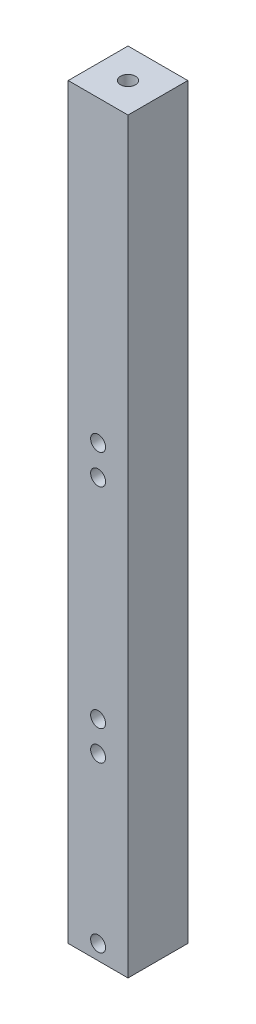
ISO-10303-21;
HEADER;
FILE_DESCRIPTION(('STEP AP214'),'2;1');
FILE_NAME('part.step','',(''),(''),'','','');
FILE_SCHEMA(('AUTOMOTIVE_DESIGN { 1 0 10303 214 1 1 1 1 }'));
ENDSEC;
DATA;
#1=APPLICATION_CONTEXT('core data for automotive mechanical design processes');
#2=APPLICATION_PROTOCOL_DEFINITION('international standard','automotive_design',2000,#1);
#3=PRODUCT_CONTEXT('',#1,'mechanical');
#4=PRODUCT('Part','Part','',(#3));
#5=PRODUCT_RELATED_PRODUCT_CATEGORY('part','',(#4));
#6=PRODUCT_DEFINITION_FORMATION('','',#4);
#7=PRODUCT_DEFINITION_CONTEXT('part definition',#1,'design');
#8=PRODUCT_DEFINITION('design','',#6,#7);
#9=PRODUCT_DEFINITION_SHAPE('','',#8);
#10=(LENGTH_UNIT() NAMED_UNIT(*) SI_UNIT(.MILLI.,.METRE.));
#11=(NAMED_UNIT(*) PLANE_ANGLE_UNIT() SI_UNIT($,.RADIAN.));
#12=(NAMED_UNIT(*) SI_UNIT($,.STERADIAN.) SOLID_ANGLE_UNIT());
#13=UNCERTAINTY_MEASURE_WITH_UNIT(LENGTH_MEASURE(1.E-05),#10,'distance_accuracy_value','');
#14=(GEOMETRIC_REPRESENTATION_CONTEXT(3) GLOBAL_UNCERTAINTY_ASSIGNED_CONTEXT((#13)) GLOBAL_UNIT_ASSIGNED_CONTEXT((#10,
#11,#12)) REPRESENTATION_CONTEXT('',''));
#15=CARTESIAN_POINT('',(0.,0.,0.));
#16=DIRECTION('',(0.,0.,1.));
#17=DIRECTION('',(1.,0.,0.));
#18=AXIS2_PLACEMENT_3D('',#15,#16,#17);
#19=CARTESIAN_POINT('',(0.,250.,0.));
#20=DIRECTION('',(0.,-1.,0.));
#21=DIRECTION('',(0.,0.,-1.));
#22=AXIS2_PLACEMENT_3D('',#19,#20,#21);
#23=CYLINDRICAL_SURFACE('',#22,2.5);
#24=CARTESIAN_POINT('',(0.,150.,0.));
#25=DIRECTION('',(0.,-0.707106781186547,0.707106781186547));
#26=DIRECTION('',(0.,-0.707106781186547,-0.707106781186547));
#27=AXIS2_PLACEMENT_3D('',#24,#25,#26);
#28=ELLIPSE('',#27,3.53553390593274,2.5);
#29=CARTESIAN_POINT('',(-2.5,150.,0.));
#30=VERTEX_POINT('',#29);
#31=CARTESIAN_POINT('',(2.5,150.,0.));
#32=VERTEX_POINT('',#31);
#33=EDGE_CURVE('E109',#30,#32,#28,.F.);
#34=ORIENTED_EDGE('',*,*,#33,.F.);
#35=CARTESIAN_POINT('',(0.,150.,0.));
#36=DIRECTION('',(0.,-0.707106781186547,-0.707106781186547));
#37=DIRECTION('',(0.,-0.707106781186547,0.707106781186547));
#38=AXIS2_PLACEMENT_3D('',#35,#36,#37);
#39=ELLIPSE('',#38,3.53553390593274,2.5);
#40=EDGE_CURVE('E47',#32,#30,#39,.F.);
#41=ORIENTED_EDGE('',*,*,#40,.F.);
#42=EDGE_LOOP('',(#34,#41));
#43=FACE_BOUND('',#42,.T.);
#44=CARTESIAN_POINT('',(0.,250.,0.));
#45=DIRECTION('',(0.,1.,0.));
#46=DIRECTION('',(0.,0.,1.));
#47=AXIS2_PLACEMENT_3D('',#44,#45,#46);
#48=CIRCLE('',#47,2.5);
#49=CARTESIAN_POINT('',(0.,250.,2.5));
#50=VERTEX_POINT('',#49);
#51=EDGE_CURVE('E180',#50,#50,#48,.T.);
#52=ORIENTED_EDGE('',*,*,#51,.T.);
#53=EDGE_LOOP('',(#52));
#54=FACE_BOUND('',#53,.T.);
#55=ADVANCED_FACE('F33',(#43,#54),#23,.F.);
#56=CARTESIAN_POINT('',(0.,70.,0.));
#57=DIRECTION('',(0.,-0.707106781186547,0.707106781186547));
#58=DIRECTION('',(0.,-0.707106781186547,-0.707106781186547));
#59=AXIS2_PLACEMENT_3D('',#56,#57,#58);
#60=ELLIPSE('',#59,3.53553390593274,2.5);
#61=CARTESIAN_POINT('',(-2.5,70.,0.));
#62=VERTEX_POINT('',#61);
#63=CARTESIAN_POINT('',(2.5,70.,0.));
#64=VERTEX_POINT('',#63);
#65=EDGE_CURVE('E136',#62,#64,#60,.F.);
#66=ORIENTED_EDGE('',*,*,#65,.F.);
#67=CARTESIAN_POINT('',(0.,70.,0.));
#68=DIRECTION('',(0.,-0.707106781186547,-0.707106781186547));
#69=DIRECTION('',(0.,-0.707106781186547,0.707106781186547));
#70=AXIS2_PLACEMENT_3D('',#67,#68,#69);
#71=ELLIPSE('',#70,3.53553390593274,2.5);
#72=EDGE_CURVE('E54',#64,#62,#71,.F.);
#73=ORIENTED_EDGE('',*,*,#72,.F.);
#74=EDGE_LOOP('',(#66,#73));
#75=FACE_BOUND('',#74,.T.);
#76=CARTESIAN_POINT('',(0.,140.,0.));
#77=DIRECTION('',(0.,-0.707106781186547,0.707106781186547));
#78=DIRECTION('',(0.,-0.707106781186547,-0.707106781186547));
#79=AXIS2_PLACEMENT_3D('',#76,#77,#78);
#80=ELLIPSE('',#79,3.53553390593274,2.5);
#81=CARTESIAN_POINT('',(-2.5,140.,0.));
#82=VERTEX_POINT('',#81);
#83=CARTESIAN_POINT('',(2.5,140.,0.));
#84=VERTEX_POINT('',#83);
#85=EDGE_CURVE('E150',#82,#84,#80,.T.);
#86=ORIENTED_EDGE('',*,*,#85,.F.);
#87=CARTESIAN_POINT('',(0.,140.,0.));
#88=DIRECTION('',(0.,-0.707106781186547,-0.707106781186547));
#89=DIRECTION('',(0.,-0.707106781186547,0.707106781186547));
#90=AXIS2_PLACEMENT_3D('',#87,#88,#89);
#91=ELLIPSE('',#90,3.53553390593274,2.5);
#92=EDGE_CURVE('E148',#84,#82,#91,.T.);
#93=ORIENTED_EDGE('',*,*,#92,.F.);
#94=EDGE_LOOP('',(#86,#93));
#95=FACE_BOUND('',#94,.T.);
#96=ADVANCED_FACE('F255',(#75,#95),#23,.F.);
#97=CARTESIAN_POINT('',(0.,150.,0.));
#98=DIRECTION('',(0.,-0.707106781186547,0.707106781186547));
#99=DIRECTION('',(0.,-0.707106781186547,-0.707106781186547));
#100=AXIS2_PLACEMENT_3D('',#97,#98,#99);
#101=ELLIPSE('',#100,3.53553390593274,2.5);
#102=EDGE_CURVE('E112',#30,#32,#101,.T.);
#103=ORIENTED_EDGE('',*,*,#102,.F.);
#104=CARTESIAN_POINT('',(0.,150.,0.));
#105=DIRECTION('',(0.,-0.707106781186547,-0.707106781186547));
#106=DIRECTION('',(0.,-0.707106781186547,0.707106781186547));
#107=AXIS2_PLACEMENT_3D('',#104,#105,#106);
#108=ELLIPSE('',#107,3.53553390593274,2.5);
#109=EDGE_CURVE('E106',#32,#30,#108,.T.);
#110=ORIENTED_EDGE('',*,*,#109,.F.);
#111=EDGE_LOOP('',(#103,#110));
#112=FACE_BOUND('',#111,.T.);
#113=CARTESIAN_POINT('',(0.,140.,0.));
#114=DIRECTION('',(0.,-0.707106781186547,0.707106781186547));
#115=DIRECTION('',(0.,-0.707106781186547,-0.707106781186547));
#116=AXIS2_PLACEMENT_3D('',#113,#114,#115);
#117=ELLIPSE('',#116,3.53553390593274,2.5);
#118=EDGE_CURVE('E153',#82,#84,#117,.F.);
#119=ORIENTED_EDGE('',*,*,#118,.F.);
#120=CARTESIAN_POINT('',(0.,140.,0.));
#121=DIRECTION('',(0.,-0.707106781186547,-0.707106781186547));
#122=DIRECTION('',(0.,-0.707106781186547,0.707106781186547));
#123=AXIS2_PLACEMENT_3D('',#120,#121,#122);
#124=ELLIPSE('',#123,3.53553390593274,2.5);
#125=EDGE_CURVE('E143',#84,#82,#124,.F.);
#126=ORIENTED_EDGE('',*,*,#125,.F.);
#127=EDGE_LOOP('',(#119,#126));
#128=FACE_BOUND('',#127,.T.);
#129=ADVANCED_FACE('F122',(#112,#128),#23,.F.);
#130=CARTESIAN_POINT('',(0.,70.,0.));
#131=DIRECTION('',(0.,-0.707106781186547,0.707106781186547));
#132=DIRECTION('',(0.,-0.707106781186547,-0.707106781186547));
#133=AXIS2_PLACEMENT_3D('',#130,#131,#132);
#134=ELLIPSE('',#133,3.53553390593274,2.5);
#135=EDGE_CURVE('E134',#62,#64,#134,.T.);
#136=ORIENTED_EDGE('',*,*,#135,.F.);
#137=CARTESIAN_POINT('',(0.,70.,0.));
#138=DIRECTION('',(0.,-0.707106781186547,-0.707106781186547));
#139=DIRECTION('',(0.,-0.707106781186547,0.707106781186547));
#140=AXIS2_PLACEMENT_3D('',#137,#138,#139);
#141=ELLIPSE('',#140,3.53553390593274,2.5);
#142=EDGE_CURVE('E132',#64,#62,#141,.T.);
#143=ORIENTED_EDGE('',*,*,#142,.F.);
#144=EDGE_LOOP('',(#136,#143));
#145=FACE_BOUND('',#144,.T.);
#146=CARTESIAN_POINT('',(0.,60.,0.));
#147=DIRECTION('',(0.,-0.707106781186547,0.707106781186547));
#148=DIRECTION('',(0.,-0.707106781186547,-0.707106781186547));
#149=AXIS2_PLACEMENT_3D('',#146,#147,#148);
#150=ELLIPSE('',#149,3.53553390593274,2.5);
#151=CARTESIAN_POINT('',(-2.5,60.,0.));
#152=VERTEX_POINT('',#151);
#153=CARTESIAN_POINT('',(2.5,60.,0.));
#154=VERTEX_POINT('',#153);
#155=EDGE_CURVE('E170',#152,#154,#150,.F.);
#156=ORIENTED_EDGE('',*,*,#155,.F.);
#157=CARTESIAN_POINT('',(0.,60.,0.));
#158=DIRECTION('',(0.,-0.707106781186547,-0.707106781186547));
#159=DIRECTION('',(0.,-0.707106781186547,0.707106781186547));
#160=AXIS2_PLACEMENT_3D('',#157,#158,#159);
#161=ELLIPSE('',#160,3.53553390593274,2.5);
#162=EDGE_CURVE('E160',#154,#152,#161,.F.);
#163=ORIENTED_EDGE('',*,*,#162,.F.);
#164=EDGE_LOOP('',(#156,#163));
#165=FACE_BOUND('',#164,.T.);
#166=ADVANCED_FACE('F365',(#145,#165),#23,.F.);
#167=CARTESIAN_POINT('',(0.,60.,0.));
#168=DIRECTION('',(0.,-0.707106781186547,0.707106781186547));
#169=DIRECTION('',(0.,-0.707106781186547,-0.707106781186547));
#170=AXIS2_PLACEMENT_3D('',#167,#168,#169);
#171=ELLIPSE('',#170,3.53553390593274,2.5);
#172=EDGE_CURVE('E167',#152,#154,#171,.T.);
#173=ORIENTED_EDGE('',*,*,#172,.F.);
#174=CARTESIAN_POINT('',(0.,60.,0.));
#175=DIRECTION('',(0.,-0.707106781186547,-0.707106781186547));
#176=DIRECTION('',(0.,-0.707106781186547,0.707106781186547));
#177=AXIS2_PLACEMENT_3D('',#174,#175,#176);
#178=ELLIPSE('',#177,3.53553390593274,2.5);
#179=EDGE_CURVE('E165',#154,#152,#178,.T.);
#180=ORIENTED_EDGE('',*,*,#179,.F.);
#181=EDGE_LOOP('',(#173,#180));
#182=FACE_BOUND('',#181,.T.);
#183=CARTESIAN_POINT('',(0.,5.,0.));
#184=DIRECTION('',(0.,-0.707106781186547,0.707106781186547));
#185=DIRECTION('',(0.,-0.707106781186547,-0.707106781186547));
#186=AXIS2_PLACEMENT_3D('',#183,#184,#185);
#187=ELLIPSE('',#186,3.53553390593274,2.5);
#188=CARTESIAN_POINT('',(-2.5,5.,0.));
#189=VERTEX_POINT('',#188);
#190=CARTESIAN_POINT('',(2.5,5.,0.));
#191=VERTEX_POINT('',#190);
#192=EDGE_CURVE('E11',#189,#191,#187,.F.);
#193=ORIENTED_EDGE('',*,*,#192,.F.);
#194=CARTESIAN_POINT('',(0.,5.,0.));
#195=DIRECTION('',(0.,-0.707106781186547,-0.707106781186547));
#196=DIRECTION('',(0.,-0.707106781186547,0.707106781186547));
#197=AXIS2_PLACEMENT_3D('',#194,#195,#196);
#198=ELLIPSE('',#197,3.53553390593274,2.5);
#199=EDGE_CURVE('E215',#191,#189,#198,.F.);
#200=ORIENTED_EDGE('',*,*,#199,.F.);
#201=EDGE_LOOP('',(#193,#200));
#202=FACE_BOUND('',#201,.T.);
#203=ADVANCED_FACE('F236',(#182,#202),#23,.F.);
#204=CARTESIAN_POINT('',(0.,250.,0.));
#205=DIRECTION('',(0.,-1.,0.));
#206=DIRECTION('',(0.,0.,-1.));
#207=AXIS2_PLACEMENT_3D('',#204,#205,#206);
#208=PLANE('',#207);
#209=DIRECTION('',(0.,0.,-1.));
#210=VECTOR('',#209,1.);
#211=CARTESIAN_POINT('',(10.,250.,10.));
#212=LINE('',#211,#210);
#213=CARTESIAN_POINT('',(10.,250.,10.));
#214=VERTEX_POINT('',#213);
#215=CARTESIAN_POINT('',(10.,250.,-10.));
#216=VERTEX_POINT('',#215);
#217=EDGE_CURVE('E186',#214,#216,#212,.T.);
#218=ORIENTED_EDGE('',*,*,#217,.T.);
#219=DIRECTION('',(-1.,0.,0.));
#220=VECTOR('',#219,1.);
#221=CARTESIAN_POINT('',(-10.,250.,-10.));
#222=LINE('',#221,#220);
#223=CARTESIAN_POINT('',(-10.,250.,-10.));
#224=VERTEX_POINT('',#223);
#225=EDGE_CURVE('E189',#216,#224,#222,.T.);
#226=ORIENTED_EDGE('',*,*,#225,.T.);
#227=DIRECTION('',(0.,0.,1.));
#228=VECTOR('',#227,1.);
#229=CARTESIAN_POINT('',(-10.,250.,10.));
#230=LINE('',#229,#228);
#231=CARTESIAN_POINT('',(-10.,250.,10.));
#232=VERTEX_POINT('',#231);
#233=EDGE_CURVE('E192',#224,#232,#230,.T.);
#234=ORIENTED_EDGE('',*,*,#233,.T.);
#235=DIRECTION('',(1.,0.,0.));
#236=VECTOR('',#235,1.);
#237=CARTESIAN_POINT('',(-10.,250.,10.));
#238=LINE('',#237,#236);
#239=EDGE_CURVE('E194',#232,#214,#238,.T.);
#240=ORIENTED_EDGE('',*,*,#239,.T.);
#241=EDGE_LOOP('',(#218,#226,#234,#240));
#242=FACE_BOUND('',#241,.T.);
#243=ORIENTED_EDGE('',*,*,#51,.F.);
#244=EDGE_LOOP('',(#243));
#245=FACE_BOUND('',#244,.T.);
#246=ADVANCED_FACE('F241',(#242,#245),#208,.F.);
#247=CARTESIAN_POINT('',(0.,0.,0.));
#248=DIRECTION('',(0.,-1.,0.));
#249=DIRECTION('',(0.,0.,-1.));
#250=AXIS2_PLACEMENT_3D('',#247,#248,#249);
#251=PLANE('',#250);
#252=DIRECTION('',(0.,0.,-1.));
#253=VECTOR('',#252,1.);
#254=CARTESIAN_POINT('',(10.,0.,10.));
#255=LINE('',#254,#253);
#256=CARTESIAN_POINT('',(10.,0.,10.));
#257=VERTEX_POINT('',#256);
#258=CARTESIAN_POINT('',(10.,0.,-10.));
#259=VERTEX_POINT('',#258);
#260=EDGE_CURVE('E183',#257,#259,#255,.T.);
#261=ORIENTED_EDGE('',*,*,#260,.F.);
#262=DIRECTION('',(1.,0.,0.));
#263=VECTOR('',#262,1.);
#264=CARTESIAN_POINT('',(-10.,0.,10.));
#265=LINE('',#264,#263);
#266=CARTESIAN_POINT('',(-10.,0.,10.));
#267=VERTEX_POINT('',#266);
#268=EDGE_CURVE('E190',#267,#257,#265,.T.);
#269=ORIENTED_EDGE('',*,*,#268,.F.);
#270=DIRECTION('',(0.,0.,1.));
#271=VECTOR('',#270,1.);
#272=CARTESIAN_POINT('',(-10.,0.,10.));
#273=LINE('',#272,#271);
#274=CARTESIAN_POINT('',(-10.,0.,-10.));
#275=VERTEX_POINT('',#274);
#276=EDGE_CURVE('E201',#275,#267,#273,.T.);
#277=ORIENTED_EDGE('',*,*,#276,.F.);
#278=DIRECTION('',(-1.,0.,0.));
#279=VECTOR('',#278,1.);
#280=CARTESIAN_POINT('',(-10.,0.,-10.));
#281=LINE('',#280,#279);
#282=EDGE_CURVE('E199',#259,#275,#281,.T.);
#283=ORIENTED_EDGE('',*,*,#282,.F.);
#284=EDGE_LOOP('',(#261,#269,#277,#283));
#285=FACE_BOUND('',#284,.T.);
#286=CARTESIAN_POINT('',(0.,0.,0.));
#287=DIRECTION('',(0.,1.,0.));
#288=DIRECTION('',(0.,0.,1.));
#289=AXIS2_PLACEMENT_3D('',#286,#287,#288);
#290=CIRCLE('',#289,2.5);
#291=CARTESIAN_POINT('',(0.,0.,2.5));
#292=VERTEX_POINT('',#291);
#293=EDGE_CURVE('E179',#292,#292,#290,.T.);
#294=ORIENTED_EDGE('',*,*,#293,.T.);
#295=EDGE_LOOP('',(#294));
#296=FACE_BOUND('',#295,.T.);
#297=ADVANCED_FACE('F239',(#285,#296),#251,.T.);
#298=CARTESIAN_POINT('',(10.,250.,10.));
#299=DIRECTION('',(-1.,0.,0.));
#300=DIRECTION('',(0.,0.,1.));
#301=AXIS2_PLACEMENT_3D('',#298,#299,#300);
#302=PLANE('',#301);
#303=ORIENTED_EDGE('',*,*,#260,.T.);
#304=DIRECTION('',(0.,-1.,0.));
#305=VECTOR('',#304,1.);
#306=CARTESIAN_POINT('',(10.,250.,-10.));
#307=LINE('',#306,#305);
#308=EDGE_CURVE('E212',#216,#259,#307,.T.);
#309=ORIENTED_EDGE('',*,*,#308,.F.);
#310=ORIENTED_EDGE('',*,*,#217,.F.);
#311=DIRECTION('',(0.,-1.,0.));
#312=VECTOR('',#311,1.);
#313=CARTESIAN_POINT('',(10.,250.,10.));
#314=LINE('',#313,#312);
#315=EDGE_CURVE('E196',#214,#257,#314,.T.);
#316=ORIENTED_EDGE('',*,*,#315,.T.);
#317=EDGE_LOOP('',(#303,#309,#310,#316));
#318=FACE_BOUND('',#317,.T.);
#319=ADVANCED_FACE('F35',(#318),#302,.F.);
#320=CARTESIAN_POINT('',(-10.,250.,-10.));
#321=DIRECTION('',(0.,0.,1.));
#322=DIRECTION('',(1.,0.,0.));
#323=AXIS2_PLACEMENT_3D('',#320,#321,#322);
#324=PLANE('',#323);
#325=CARTESIAN_POINT('',(0.,150.,-10.));
#326=DIRECTION('',(0.,0.,1.));
#327=DIRECTION('',(1.,0.,0.));
#328=AXIS2_PLACEMENT_3D('',#325,#326,#327);
#329=CIRCLE('',#328,2.5);
#330=CARTESIAN_POINT('',(2.5,150.,-10.));
#331=VERTEX_POINT('',#330);
#332=EDGE_CURVE('E117',#331,#331,#329,.T.);
#333=ORIENTED_EDGE('',*,*,#332,.T.);
#334=EDGE_LOOP('',(#333));
#335=FACE_BOUND('',#334,.T.);
#336=CARTESIAN_POINT('',(0.,70.,-10.));
#337=DIRECTION('',(0.,0.,1.));
#338=DIRECTION('',(1.,0.,0.));
#339=AXIS2_PLACEMENT_3D('',#336,#337,#338);
#340=CIRCLE('',#339,2.5);
#341=CARTESIAN_POINT('',(2.5,70.,-10.));
#342=VERTEX_POINT('',#341);
#343=EDGE_CURVE('E126',#342,#342,#340,.T.);
#344=ORIENTED_EDGE('',*,*,#343,.T.);
#345=EDGE_LOOP('',(#344));
#346=FACE_BOUND('',#345,.T.);
#347=CARTESIAN_POINT('',(0.,140.,-10.));
#348=DIRECTION('',(0.,0.,1.));
#349=DIRECTION('',(1.,0.,0.));
#350=AXIS2_PLACEMENT_3D('',#347,#348,#349);
#351=CIRCLE('',#350,2.5);
#352=CARTESIAN_POINT('',(2.5,140.,-10.));
#353=VERTEX_POINT('',#352);
#354=EDGE_CURVE('E140',#353,#353,#351,.T.);
#355=ORIENTED_EDGE('',*,*,#354,.T.);
#356=EDGE_LOOP('',(#355));
#357=FACE_BOUND('',#356,.T.);
#358=CARTESIAN_POINT('',(0.,60.,-10.));
#359=DIRECTION('',(0.,0.,1.));
#360=DIRECTION('',(1.,0.,0.));
#361=AXIS2_PLACEMENT_3D('',#358,#359,#360);
#362=CIRCLE('',#361,2.5);
#363=CARTESIAN_POINT('',(2.5,60.,-10.));
#364=VERTEX_POINT('',#363);
#365=EDGE_CURVE('E157',#364,#364,#362,.T.);
#366=ORIENTED_EDGE('',*,*,#365,.T.);
#367=EDGE_LOOP('',(#366));
#368=FACE_BOUND('',#367,.T.);
#369=CARTESIAN_POINT('',(0.,5.,-9.99999999999999));
#370=DIRECTION('',(0.,0.,1.));
#371=DIRECTION('',(1.,0.,0.));
#372=AXIS2_PLACEMENT_3D('',#369,#370,#371);
#373=CIRCLE('',#372,2.5);
#374=CARTESIAN_POINT('',(2.5,5.,-9.99999999999999));
#375=VERTEX_POINT('',#374);
#376=EDGE_CURVE('E176',#375,#375,#373,.T.);
#377=ORIENTED_EDGE('',*,*,#376,.T.);
#378=EDGE_LOOP('',(#377));
#379=FACE_BOUND('',#378,.T.);
#380=ORIENTED_EDGE('',*,*,#282,.T.);
#381=DIRECTION('',(0.,-1.,0.));
#382=VECTOR('',#381,1.);
#383=CARTESIAN_POINT('',(-10.,250.,-10.));
#384=LINE('',#383,#382);
#385=EDGE_CURVE('E209',#224,#275,#384,.T.);
#386=ORIENTED_EDGE('',*,*,#385,.F.);
#387=ORIENTED_EDGE('',*,*,#225,.F.);
#388=ORIENTED_EDGE('',*,*,#308,.T.);
#389=EDGE_LOOP('',(#380,#386,#387,#388));
#390=FACE_BOUND('',#389,.T.);
#391=ADVANCED_FACE('F248',(#335,#346,#357,#368,#379,#390),#324,.F.);
#392=CARTESIAN_POINT('',(-10.,250.,10.));
#393=DIRECTION('',(1.,0.,0.));
#394=DIRECTION('',(0.,0.,-1.));
#395=AXIS2_PLACEMENT_3D('',#392,#393,#394);
#396=PLANE('',#395);
#397=ORIENTED_EDGE('',*,*,#276,.T.);
#398=DIRECTION('',(0.,-1.,0.));
#399=VECTOR('',#398,1.);
#400=CARTESIAN_POINT('',(-10.,250.,10.));
#401=LINE('',#400,#399);
#402=EDGE_CURVE('E206',#232,#267,#401,.T.);
#403=ORIENTED_EDGE('',*,*,#402,.F.);
#404=ORIENTED_EDGE('',*,*,#233,.F.);
#405=ORIENTED_EDGE('',*,*,#385,.T.);
#406=EDGE_LOOP('',(#397,#403,#404,#405));
#407=FACE_BOUND('',#406,.T.);
#408=ADVANCED_FACE('F291',(#407),#396,.F.);
#409=CARTESIAN_POINT('',(-10.,250.,10.));
#410=DIRECTION('',(0.,0.,-1.));
#411=DIRECTION('',(-1.,0.,0.));
#412=AXIS2_PLACEMENT_3D('',#409,#410,#411);
#413=PLANE('',#412);
#414=CARTESIAN_POINT('',(0.,150.,10.));
#415=DIRECTION('',(0.,0.,1.));
#416=DIRECTION('',(1.,0.,0.));
#417=AXIS2_PLACEMENT_3D('',#414,#415,#416);
#418=CIRCLE('',#417,2.5);
#419=CARTESIAN_POINT('',(2.5,150.,10.));
#420=VERTEX_POINT('',#419);
#421=EDGE_CURVE('E321',#420,#420,#418,.T.);
#422=ORIENTED_EDGE('',*,*,#421,.F.);
#423=EDGE_LOOP('',(#422));
#424=FACE_BOUND('',#423,.T.);
#425=CARTESIAN_POINT('',(0.,70.,10.));
#426=DIRECTION('',(0.,0.,1.));
#427=DIRECTION('',(1.,0.,0.));
#428=AXIS2_PLACEMENT_3D('',#425,#426,#427);
#429=CIRCLE('',#428,2.5);
#430=CARTESIAN_POINT('',(2.5,70.,10.));
#431=VERTEX_POINT('',#430);
#432=EDGE_CURVE('E120',#431,#431,#429,.T.);
#433=ORIENTED_EDGE('',*,*,#432,.F.);
#434=EDGE_LOOP('',(#433));
#435=FACE_BOUND('',#434,.T.);
#436=CARTESIAN_POINT('',(0.,140.,10.));
#437=DIRECTION('',(0.,0.,1.));
#438=DIRECTION('',(1.,0.,0.));
#439=AXIS2_PLACEMENT_3D('',#436,#437,#438);
#440=CIRCLE('',#439,2.5);
#441=CARTESIAN_POINT('',(2.5,140.,10.));
#442=VERTEX_POINT('',#441);
#443=EDGE_CURVE('E139',#442,#442,#440,.T.);
#444=ORIENTED_EDGE('',*,*,#443,.F.);
#445=EDGE_LOOP('',(#444));
#446=FACE_BOUND('',#445,.T.);
#447=CARTESIAN_POINT('',(0.,60.,10.));
#448=DIRECTION('',(0.,0.,1.));
#449=DIRECTION('',(1.,0.,0.));
#450=AXIS2_PLACEMENT_3D('',#447,#448,#449);
#451=CIRCLE('',#450,2.5);
#452=CARTESIAN_POINT('',(2.5,60.,10.));
#453=VERTEX_POINT('',#452);
#454=EDGE_CURVE('E156',#453,#453,#451,.T.);
#455=ORIENTED_EDGE('',*,*,#454,.F.);
#456=EDGE_LOOP('',(#455));
#457=FACE_BOUND('',#456,.T.);
#458=CARTESIAN_POINT('',(0.,5.,10.));
#459=DIRECTION('',(0.,0.,1.));
#460=DIRECTION('',(1.,0.,0.));
#461=AXIS2_PLACEMENT_3D('',#458,#459,#460);
#462=CIRCLE('',#461,2.5);
#463=CARTESIAN_POINT('',(2.5,5.,10.));
#464=VERTEX_POINT('',#463);
#465=EDGE_CURVE('E173',#464,#464,#462,.T.);
#466=ORIENTED_EDGE('',*,*,#465,.F.);
#467=EDGE_LOOP('',(#466));
#468=FACE_BOUND('',#467,.T.);
#469=ORIENTED_EDGE('',*,*,#268,.T.);
#470=ORIENTED_EDGE('',*,*,#315,.F.);
#471=ORIENTED_EDGE('',*,*,#239,.F.);
#472=ORIENTED_EDGE('',*,*,#402,.T.);
#473=EDGE_LOOP('',(#469,#470,#471,#472));
#474=FACE_BOUND('',#473,.T.);
#475=ADVANCED_FACE('F234',(#424,#435,#446,#457,#468,#474),#413,.F.);
#476=CARTESIAN_POINT('',(0.,5.,0.));
#477=DIRECTION('',(0.,-0.707106781186547,0.707106781186547));
#478=DIRECTION('',(0.,-0.707106781186547,-0.707106781186547));
#479=AXIS2_PLACEMENT_3D('',#476,#477,#478);
#480=ELLIPSE('',#479,3.53553390593274,2.5);
#481=EDGE_CURVE('E41',#189,#191,#480,.T.);
#482=ORIENTED_EDGE('',*,*,#481,.F.);
#483=CARTESIAN_POINT('',(0.,5.,0.));
#484=DIRECTION('',(0.,-0.707106781186547,-0.707106781186547));
#485=DIRECTION('',(0.,-0.707106781186547,0.707106781186547));
#486=AXIS2_PLACEMENT_3D('',#483,#484,#485);
#487=ELLIPSE('',#486,3.53553390593274,2.5);
#488=EDGE_CURVE('E218',#191,#189,#487,.T.);
#489=ORIENTED_EDGE('',*,*,#488,.F.);
#490=EDGE_LOOP('',(#482,#489));
#491=FACE_BOUND('',#490,.T.);
#492=ORIENTED_EDGE('',*,*,#293,.F.);
#493=EDGE_LOOP('',(#492));
#494=FACE_BOUND('',#493,.T.);
#495=ADVANCED_FACE('F231',(#491,#494),#23,.F.);
#496=CARTESIAN_POINT('',(0.,5.,-90.));
#497=DIRECTION('',(0.,0.,1.));
#498=DIRECTION('',(1.,0.,0.));
#499=AXIS2_PLACEMENT_3D('',#496,#497,#498);
#500=CYLINDRICAL_SURFACE('',#499,2.5);
#501=ORIENTED_EDGE('',*,*,#481,.T.);
#502=ORIENTED_EDGE('',*,*,#199,.T.);
#503=EDGE_LOOP('',(#501,#502));
#504=FACE_BOUND('',#503,.T.);
#505=ORIENTED_EDGE('',*,*,#376,.F.);
#506=EDGE_LOOP('',(#505));
#507=FACE_BOUND('',#506,.T.);
#508=ADVANCED_FACE('F222',(#504,#507),#500,.F.);
#509=ORIENTED_EDGE('',*,*,#192,.T.);
#510=ORIENTED_EDGE('',*,*,#488,.T.);
#511=EDGE_LOOP('',(#509,#510));
#512=FACE_BOUND('',#511,.T.);
#513=ORIENTED_EDGE('',*,*,#465,.T.);
#514=EDGE_LOOP('',(#513));
#515=FACE_BOUND('',#514,.T.);
#516=ADVANCED_FACE('F228',(#512,#515),#500,.F.);
#517=CARTESIAN_POINT('',(0.,60.,-10.));
#518=DIRECTION('',(0.,0.,1.));
#519=DIRECTION('',(1.,0.,0.));
#520=AXIS2_PLACEMENT_3D('',#517,#518,#519);
#521=CYLINDRICAL_SURFACE('',#520,2.5);
#522=ORIENTED_EDGE('',*,*,#155,.T.);
#523=ORIENTED_EDGE('',*,*,#179,.T.);
#524=EDGE_LOOP('',(#522,#523));
#525=FACE_BOUND('',#524,.T.);
#526=ORIENTED_EDGE('',*,*,#454,.T.);
#527=EDGE_LOOP('',(#526));
#528=FACE_BOUND('',#527,.T.);
#529=ADVANCED_FACE('F262',(#525,#528),#521,.F.);
#530=ORIENTED_EDGE('',*,*,#172,.T.);
#531=ORIENTED_EDGE('',*,*,#162,.T.);
#532=EDGE_LOOP('',(#530,#531));
#533=FACE_BOUND('',#532,.T.);
#534=ORIENTED_EDGE('',*,*,#365,.F.);
#535=EDGE_LOOP('',(#534));
#536=FACE_BOUND('',#535,.T.);
#537=ADVANCED_FACE('F265',(#533,#536),#521,.F.);
#538=CARTESIAN_POINT('',(0.,140.,-10.));
#539=DIRECTION('',(0.,0.,1.));
#540=DIRECTION('',(1.,0.,0.));
#541=AXIS2_PLACEMENT_3D('',#538,#539,#540);
#542=CYLINDRICAL_SURFACE('',#541,2.5);
#543=ORIENTED_EDGE('',*,*,#118,.T.);
#544=ORIENTED_EDGE('',*,*,#92,.T.);
#545=EDGE_LOOP('',(#543,#544));
#546=FACE_BOUND('',#545,.T.);
#547=ORIENTED_EDGE('',*,*,#443,.T.);
#548=EDGE_LOOP('',(#547));
#549=FACE_BOUND('',#548,.T.);
#550=ADVANCED_FACE('F267',(#546,#549),#542,.F.);
#551=ORIENTED_EDGE('',*,*,#85,.T.);
#552=ORIENTED_EDGE('',*,*,#125,.T.);
#553=EDGE_LOOP('',(#551,#552));
#554=FACE_BOUND('',#553,.T.);
#555=ORIENTED_EDGE('',*,*,#354,.F.);
#556=EDGE_LOOP('',(#555));
#557=FACE_BOUND('',#556,.T.);
#558=ADVANCED_FACE('F270',(#554,#557),#542,.F.);
#559=CARTESIAN_POINT('',(0.,70.,-10.));
#560=DIRECTION('',(0.,0.,1.));
#561=DIRECTION('',(1.,0.,0.));
#562=AXIS2_PLACEMENT_3D('',#559,#560,#561);
#563=CYLINDRICAL_SURFACE('',#562,2.5);
#564=ORIENTED_EDGE('',*,*,#65,.T.);
#565=ORIENTED_EDGE('',*,*,#142,.T.);
#566=EDGE_LOOP('',(#564,#565));
#567=FACE_BOUND('',#566,.T.);
#568=ORIENTED_EDGE('',*,*,#432,.T.);
#569=EDGE_LOOP('',(#568));
#570=FACE_BOUND('',#569,.T.);
#571=ADVANCED_FACE('F272',(#567,#570),#563,.F.);
#572=ORIENTED_EDGE('',*,*,#135,.T.);
#573=ORIENTED_EDGE('',*,*,#72,.T.);
#574=EDGE_LOOP('',(#572,#573));
#575=FACE_BOUND('',#574,.T.);
#576=ORIENTED_EDGE('',*,*,#343,.F.);
#577=EDGE_LOOP('',(#576));
#578=FACE_BOUND('',#577,.T.);
#579=ADVANCED_FACE('F275',(#575,#578),#563,.F.);
#580=CARTESIAN_POINT('',(0.,150.,-10.));
#581=DIRECTION('',(0.,0.,1.));
#582=DIRECTION('',(1.,0.,0.));
#583=AXIS2_PLACEMENT_3D('',#580,#581,#582);
#584=CYLINDRICAL_SURFACE('',#583,2.5);
#585=ORIENTED_EDGE('',*,*,#33,.T.);
#586=ORIENTED_EDGE('',*,*,#109,.T.);
#587=EDGE_LOOP('',(#585,#586));
#588=FACE_BOUND('',#587,.T.);
#589=ORIENTED_EDGE('',*,*,#421,.T.);
#590=EDGE_LOOP('',(#589));
#591=FACE_BOUND('',#590,.T.);
#592=ADVANCED_FACE('F107',(#588,#591),#584,.F.);
#593=ORIENTED_EDGE('',*,*,#102,.T.);
#594=ORIENTED_EDGE('',*,*,#40,.T.);
#595=EDGE_LOOP('',(#593,#594));
#596=FACE_BOUND('',#595,.T.);
#597=ORIENTED_EDGE('',*,*,#332,.F.);
#598=EDGE_LOOP('',(#597));
#599=FACE_BOUND('',#598,.T.);
#600=ADVANCED_FACE('F115',(#596,#599),#584,.F.);
#601=CLOSED_SHELL('',(#55,#96,#129,#166,#203,#246,#297,#319,#391,#408,#475,#495,#508,#516,#529,
#537,#550,#558,#571,#579,#592,#600));
#602=MANIFOLD_SOLID_BREP('B2',#601);
#603=ADVANCED_BREP_SHAPE_REPRESENTATION('',(#18,#602),#14);
#604=SHAPE_DEFINITION_REPRESENTATION(#9,#603);
ENDSEC;
END-ISO-10303-21;
